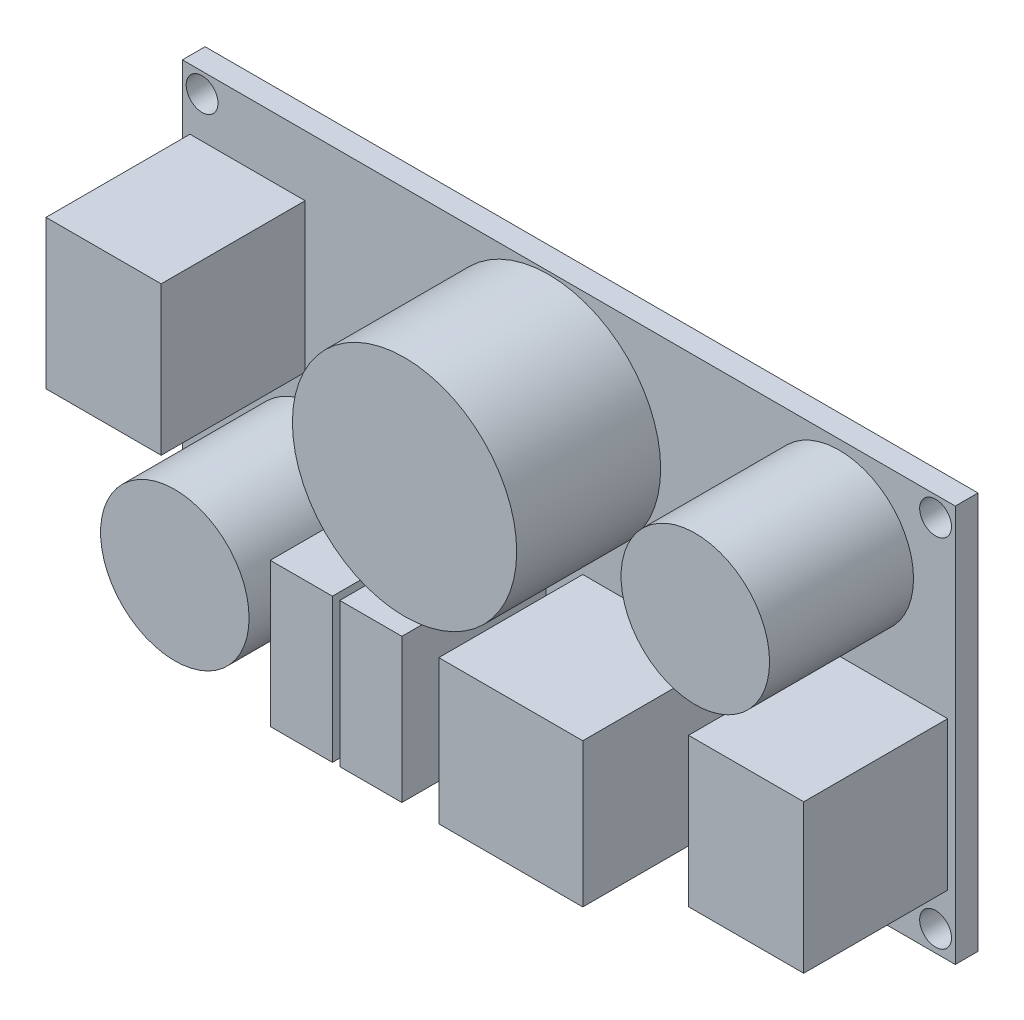
ISO-10303-21;
HEADER;
FILE_DESCRIPTION(('STEP AP214'),'2;1');
FILE_NAME('part.step','',(''),(''),'','','');
FILE_SCHEMA(('AUTOMOTIVE_DESIGN { 1 0 10303 214 1 1 1 1 }'));
ENDSEC;
DATA;
#1=APPLICATION_CONTEXT('core data for automotive mechanical design processes');
#2=APPLICATION_PROTOCOL_DEFINITION('international standard','automotive_design',2000,#1);
#3=PRODUCT_CONTEXT('',#1,'mechanical');
#4=PRODUCT('Part','Part','',(#3));
#5=PRODUCT_RELATED_PRODUCT_CATEGORY('part','',(#4));
#6=PRODUCT_DEFINITION_FORMATION('','',#4);
#7=PRODUCT_DEFINITION_CONTEXT('part definition',#1,'design');
#8=PRODUCT_DEFINITION('design','',#6,#7);
#9=PRODUCT_DEFINITION_SHAPE('','',#8);
#10=(LENGTH_UNIT() NAMED_UNIT(*) SI_UNIT(.MILLI.,.METRE.));
#11=(NAMED_UNIT(*) PLANE_ANGLE_UNIT() SI_UNIT($,.RADIAN.));
#12=(NAMED_UNIT(*) SI_UNIT($,.STERADIAN.) SOLID_ANGLE_UNIT());
#13=UNCERTAINTY_MEASURE_WITH_UNIT(LENGTH_MEASURE(1.E-05),#10,'distance_accuracy_value','');
#14=(GEOMETRIC_REPRESENTATION_CONTEXT(3) GLOBAL_UNCERTAINTY_ASSIGNED_CONTEXT((#13)) GLOBAL_UNIT_ASSIGNED_CONTEXT((#10,
#11,#12)) REPRESENTATION_CONTEXT('',''));
#15=CARTESIAN_POINT('',(0.,0.,0.));
#16=DIRECTION('',(0.,0.,1.));
#17=DIRECTION('',(1.,0.,0.));
#18=AXIS2_PLACEMENT_3D('',#15,#16,#17);
#19=CARTESIAN_POINT('',(0.,0.,1.5));
#20=DIRECTION('',(0.,0.,1.));
#21=DIRECTION('',(1.,0.,0.));
#22=AXIS2_PLACEMENT_3D('',#19,#20,#21);
#23=PLANE('',#22);
#24=CARTESIAN_POINT('',(-24.2002128836283,-11.7070965702177,1.5));
#25=DIRECTION('',(0.,0.,1.));
#26=DIRECTION('',(1.,0.,0.));
#27=AXIS2_PLACEMENT_3D('',#24,#25,#26);
#28=CIRCLE('',#27,1.05);
#29=CARTESIAN_POINT('',(-23.1502128836283,-11.7070965702177,1.5));
#30=VERTEX_POINT('',#29);
#31=EDGE_CURVE('E817',#30,#30,#28,.T.);
#32=ORIENTED_EDGE('',*,*,#31,.F.);
#33=EDGE_LOOP('',(#32));
#34=FACE_BOUND('',#33,.T.);
#35=CARTESIAN_POINT('',(24.1997871163717,-11.7070965702177,1.5));
#36=DIRECTION('',(0.,0.,1.));
#37=DIRECTION('',(1.,0.,0.));
#38=AXIS2_PLACEMENT_3D('',#35,#36,#37);
#39=CIRCLE('',#38,1.05);
#40=CARTESIAN_POINT('',(25.2497871163717,-11.7070965702177,1.5));
#41=VERTEX_POINT('',#40);
#42=EDGE_CURVE('E819',#41,#41,#39,.T.);
#43=ORIENTED_EDGE('',*,*,#42,.F.);
#44=EDGE_LOOP('',(#43));
#45=FACE_BOUND('',#44,.T.);
#46=CARTESIAN_POINT('',(24.1997871163715,11.7929034297823,1.5));
#47=DIRECTION('',(0.,0.,1.));
#48=DIRECTION('',(1.,0.,0.));
#49=AXIS2_PLACEMENT_3D('',#46,#47,#48);
#50=CIRCLE('',#49,1.05);
#51=CARTESIAN_POINT('',(25.2497871163715,11.7929034297823,1.5));
#52=VERTEX_POINT('',#51);
#53=EDGE_CURVE('E861',#52,#52,#50,.T.);
#54=ORIENTED_EDGE('',*,*,#53,.F.);
#55=EDGE_LOOP('',(#54));
#56=FACE_BOUND('',#55,.T.);
#57=CARTESIAN_POINT('',(-24.2002128836285,11.7929034297823,1.5));
#58=DIRECTION('',(0.,0.,1.));
#59=DIRECTION('',(1.,0.,0.));
#60=AXIS2_PLACEMENT_3D('',#57,#58,#59);
#61=CIRCLE('',#60,1.05);
#62=CARTESIAN_POINT('',(-23.1502128836285,11.7929034297823,1.5));
#63=VERTEX_POINT('',#62);
#64=EDGE_CURVE('E827',#63,#63,#61,.T.);
#65=ORIENTED_EDGE('',*,*,#64,.F.);
#66=EDGE_LOOP('',(#65));
#67=FACE_BOUND('',#66,.T.);
#68=CARTESIAN_POINT('',(-16.5,-7.09999999999999,1.5));
#69=DIRECTION('',(0.,0.,1.));
#70=DIRECTION('',(1.,0.,0.));
#71=AXIS2_PLACEMENT_3D('',#68,#69,#70);
#72=CIRCLE('',#71,4.9);
#73=CARTESIAN_POINT('',(-11.6,-7.09999999999999,1.5));
#74=VERTEX_POINT('',#73);
#75=EDGE_CURVE('E826',#74,#74,#72,.T.);
#76=ORIENTED_EDGE('',*,*,#75,.F.);
#77=EDGE_LOOP('',(#76));
#78=FACE_BOUND('',#77,.T.);
#79=CARTESIAN_POINT('',(-1.34038090498764,5.51921549112562,1.5));
#80=DIRECTION('',(0.,0.,1.));
#81=DIRECTION('',(1.,0.,0.));
#82=AXIS2_PLACEMENT_3D('',#79,#80,#81);
#83=CIRCLE('',#82,7.4);
#84=CARTESIAN_POINT('',(6.05961909501236,5.51921549112562,1.5));
#85=VERTEX_POINT('',#84);
#86=EDGE_CURVE('E223',#85,#85,#83,.T.);
#87=ORIENTED_EDGE('',*,*,#86,.F.);
#88=EDGE_LOOP('',(#87));
#89=FACE_BOUND('',#88,.T.);
#90=CARTESIAN_POINT('',(17.8454634213061,7.56920981640084,1.5));
#91=DIRECTION('',(0.,0.,1.));
#92=DIRECTION('',(1.,0.,0.));
#93=AXIS2_PLACEMENT_3D('',#90,#91,#92);
#94=CIRCLE('',#93,4.9);
#95=CARTESIAN_POINT('',(22.7454634213061,7.56920981640084,1.5));
#96=VERTEX_POINT('',#95);
#97=EDGE_CURVE('E232',#96,#96,#94,.T.);
#98=ORIENTED_EDGE('',*,*,#97,.F.);
#99=EDGE_LOOP('',(#98));
#100=FACE_BOUND('',#99,.T.);
#101=DIRECTION('',(0.,1.,0.));
#102=VECTOR('',#101,1.);
#103=CARTESIAN_POINT('',(25.5,13.1,1.5));
#104=LINE('',#103,#102);
#105=CARTESIAN_POINT('',(25.5,-13.1,1.5));
#106=VERTEX_POINT('',#105);
#107=CARTESIAN_POINT('',(25.5,13.1,1.5));
#108=VERTEX_POINT('',#107);
#109=EDGE_CURVE('E354',#106,#108,#104,.T.);
#110=ORIENTED_EDGE('',*,*,#109,.T.);
#111=DIRECTION('',(-1.,0.,0.));
#112=VECTOR('',#111,1.);
#113=CARTESIAN_POINT('',(-25.5,13.1,1.5));
#114=LINE('',#113,#112);
#115=CARTESIAN_POINT('',(-25.5,13.1,1.5));
#116=VERTEX_POINT('',#115);
#117=EDGE_CURVE('E357',#108,#116,#114,.T.);
#118=ORIENTED_EDGE('',*,*,#117,.T.);
#119=DIRECTION('',(0.,-1.,0.));
#120=VECTOR('',#119,1.);
#121=CARTESIAN_POINT('',(-25.5,13.1,1.5));
#122=LINE('',#121,#120);
#123=CARTESIAN_POINT('',(-25.5,-13.1,1.5));
#124=VERTEX_POINT('',#123);
#125=EDGE_CURVE('E360',#116,#124,#122,.T.);
#126=ORIENTED_EDGE('',*,*,#125,.T.);
#127=DIRECTION('',(1.,0.,0.));
#128=VECTOR('',#127,1.);
#129=CARTESIAN_POINT('',(-25.5,-13.1,1.5));
#130=LINE('',#129,#128);
#131=EDGE_CURVE('E362',#124,#106,#130,.T.);
#132=ORIENTED_EDGE('',*,*,#131,.T.);
#133=EDGE_LOOP('',(#110,#118,#126,#132));
#134=FACE_BOUND('',#133,.T.);
#135=DIRECTION('',(-1.,0.,0.));
#136=VECTOR('',#135,1.);
#137=CARTESIAN_POINT('',(-25.,9.10000000000001,1.5));
#138=LINE('',#137,#136);
#139=CARTESIAN_POINT('',(-17.4,9.10000000000001,1.5));
#140=VERTEX_POINT('',#139);
#141=CARTESIAN_POINT('',(-25.,9.10000000000001,1.5));
#142=VERTEX_POINT('',#141);
#143=EDGE_CURVE('E338',#140,#142,#138,.T.);
#144=ORIENTED_EDGE('',*,*,#143,.F.);
#145=DIRECTION('',(0.,1.,0.));
#146=VECTOR('',#145,1.);
#147=CARTESIAN_POINT('',(-17.4,9.10000000000001,1.5));
#148=LINE('',#147,#146);
#149=CARTESIAN_POINT('',(-17.4,-0.699999999999994,1.5));
#150=VERTEX_POINT('',#149);
#151=EDGE_CURVE('E324',#150,#140,#148,.T.);
#152=ORIENTED_EDGE('',*,*,#151,.F.);
#153=DIRECTION('',(1.,0.,0.));
#154=VECTOR('',#153,1.);
#155=CARTESIAN_POINT('',(-25.,-0.699999999999994,1.5));
#156=LINE('',#155,#154);
#157=CARTESIAN_POINT('',(-25.,-0.699999999999994,1.5));
#158=VERTEX_POINT('',#157);
#159=EDGE_CURVE('E329',#158,#150,#156,.T.);
#160=ORIENTED_EDGE('',*,*,#159,.F.);
#161=DIRECTION('',(0.,-1.,0.));
#162=VECTOR('',#161,1.);
#163=CARTESIAN_POINT('',(-25.,9.10000000000001,1.5));
#164=LINE('',#163,#162);
#165=EDGE_CURVE('E340',#142,#158,#164,.T.);
#166=ORIENTED_EDGE('',*,*,#165,.F.);
#167=EDGE_LOOP('',(#144,#152,#160,#166));
#168=FACE_BOUND('',#167,.T.);
#169=DIRECTION('',(-1.,0.,0.));
#170=VECTOR('',#169,1.);
#171=CARTESIAN_POINT('',(17.4,0.700000000000008,1.5));
#172=LINE('',#171,#170);
#173=CARTESIAN_POINT('',(25.,0.700000000000008,1.5));
#174=VERTEX_POINT('',#173);
#175=CARTESIAN_POINT('',(17.4,0.700000000000008,1.5));
#176=VERTEX_POINT('',#175);
#177=EDGE_CURVE('E309',#174,#176,#172,.T.);
#178=ORIENTED_EDGE('',*,*,#177,.F.);
#179=DIRECTION('',(0.,1.,0.));
#180=VECTOR('',#179,1.);
#181=CARTESIAN_POINT('',(25.,0.700000000000008,1.5));
#182=LINE('',#181,#180);
#183=CARTESIAN_POINT('',(25.,-9.09999999999999,1.5));
#184=VERTEX_POINT('',#183);
#185=EDGE_CURVE('E295',#184,#174,#182,.T.);
#186=ORIENTED_EDGE('',*,*,#185,.F.);
#187=DIRECTION('',(1.,0.,0.));
#188=VECTOR('',#187,1.);
#189=CARTESIAN_POINT('',(17.4,-9.09999999999999,1.5));
#190=LINE('',#189,#188);
#191=CARTESIAN_POINT('',(17.4,-9.09999999999999,1.5));
#192=VERTEX_POINT('',#191);
#193=EDGE_CURVE('E300',#192,#184,#190,.T.);
#194=ORIENTED_EDGE('',*,*,#193,.F.);
#195=DIRECTION('',(0.,-1.,0.));
#196=VECTOR('',#195,1.);
#197=CARTESIAN_POINT('',(17.4,0.700000000000008,1.5));
#198=LINE('',#197,#196);
#199=EDGE_CURVE('E311',#176,#192,#198,.T.);
#200=ORIENTED_EDGE('',*,*,#199,.F.);
#201=EDGE_LOOP('',(#178,#186,#194,#200));
#202=FACE_BOUND('',#201,.T.);
#203=DIRECTION('',(-1.,0.,0.));
#204=VECTOR('',#203,1.);
#205=CARTESIAN_POINT('',(-10.2,-3.09999999999999,1.5));
#206=LINE('',#205,#204);
#207=CARTESIAN_POINT('',(-6.09999999999998,-3.09999999999999,1.5));
#208=VERTEX_POINT('',#207);
#209=CARTESIAN_POINT('',(-10.2,-3.09999999999999,1.5));
#210=VERTEX_POINT('',#209);
#211=EDGE_CURVE('E280',#208,#210,#206,.T.);
#212=ORIENTED_EDGE('',*,*,#211,.F.);
#213=DIRECTION('',(0.,1.,0.));
#214=VECTOR('',#213,1.);
#215=CARTESIAN_POINT('',(-6.09999999999998,-3.09999999999999,1.5));
#216=LINE('',#215,#214);
#217=CARTESIAN_POINT('',(-6.09999999999998,-12.6,1.5));
#218=VERTEX_POINT('',#217);
#219=EDGE_CURVE('E266',#218,#208,#216,.T.);
#220=ORIENTED_EDGE('',*,*,#219,.F.);
#221=DIRECTION('',(1.,0.,0.));
#222=VECTOR('',#221,1.);
#223=CARTESIAN_POINT('',(-10.2,-12.6,1.5));
#224=LINE('',#223,#222);
#225=CARTESIAN_POINT('',(-10.2,-12.6,1.5));
#226=VERTEX_POINT('',#225);
#227=EDGE_CURVE('E271',#226,#218,#224,.T.);
#228=ORIENTED_EDGE('',*,*,#227,.F.);
#229=DIRECTION('',(0.,-1.,0.));
#230=VECTOR('',#229,1.);
#231=CARTESIAN_POINT('',(-10.2,-3.09999999999999,1.5));
#232=LINE('',#231,#230);
#233=EDGE_CURVE('E282',#210,#226,#232,.T.);
#234=ORIENTED_EDGE('',*,*,#233,.F.);
#235=EDGE_LOOP('',(#212,#220,#228,#234));
#236=FACE_BOUND('',#235,.T.);
#237=DIRECTION('',(-1.,0.,0.));
#238=VECTOR('',#237,1.);
#239=CARTESIAN_POINT('',(-5.61558274573255,-3.09999999999999,1.5));
#240=LINE('',#239,#238);
#241=CARTESIAN_POINT('',(-1.51558274573255,-3.09999999999999,1.5));
#242=VERTEX_POINT('',#241);
#243=CARTESIAN_POINT('',(-5.61558274573255,-3.09999999999999,1.5));
#244=VERTEX_POINT('',#243);
#245=EDGE_CURVE('E253',#242,#244,#240,.T.);
#246=ORIENTED_EDGE('',*,*,#245,.F.);
#247=DIRECTION('',(0.,1.,0.));
#248=VECTOR('',#247,1.);
#249=CARTESIAN_POINT('',(-1.51558274573255,-3.09999999999999,1.5));
#250=LINE('',#249,#248);
#251=CARTESIAN_POINT('',(-1.51558274573255,-12.6,1.5));
#252=VERTEX_POINT('',#251);
#253=EDGE_CURVE('E237',#252,#242,#250,.T.);
#254=ORIENTED_EDGE('',*,*,#253,.F.);
#255=DIRECTION('',(1.,0.,0.));
#256=VECTOR('',#255,1.);
#257=CARTESIAN_POINT('',(-5.61558274573255,-12.6,1.5));
#258=LINE('',#257,#256);
#259=CARTESIAN_POINT('',(-5.61558274573255,-12.6,1.5));
#260=VERTEX_POINT('',#259);
#261=EDGE_CURVE('E244',#260,#252,#258,.T.);
#262=ORIENTED_EDGE('',*,*,#261,.F.);
#263=DIRECTION('',(0.,-1.,0.));
#264=VECTOR('',#263,1.);
#265=CARTESIAN_POINT('',(-5.61558274573255,-3.09999999999999,1.5));
#266=LINE('',#265,#264);
#267=EDGE_CURVE('E255',#244,#260,#266,.T.);
#268=ORIENTED_EDGE('',*,*,#267,.F.);
#269=EDGE_LOOP('',(#246,#254,#262,#268));
#270=FACE_BOUND('',#269,.T.);
#271=DIRECTION('',(-1.,0.,0.));
#272=VECTOR('',#271,1.);
#273=CARTESIAN_POINT('',(0.919869248520959,-3.10127346644199,1.5));
#274=LINE('',#273,#272);
#275=CARTESIAN_POINT('',(10.419869248521,-3.10127346644199,1.5));
#276=VERTEX_POINT('',#275);
#277=CARTESIAN_POINT('',(0.919869248520959,-3.10127346644199,1.5));
#278=VERTEX_POINT('',#277);
#279=EDGE_CURVE('E840',#276,#278,#274,.T.);
#280=ORIENTED_EDGE('',*,*,#279,.F.);
#281=DIRECTION('',(0.,1.,0.));
#282=VECTOR('',#281,1.);
#283=CARTESIAN_POINT('',(10.419869248521,-3.10127346644199,1.5));
#284=LINE('',#283,#282);
#285=CARTESIAN_POINT('',(10.419869248521,-12.601273466442,1.5));
#286=VERTEX_POINT('',#285);
#287=EDGE_CURVE('E221',#286,#276,#284,.T.);
#288=ORIENTED_EDGE('',*,*,#287,.F.);
#289=DIRECTION('',(1.,0.,0.));
#290=VECTOR('',#289,1.);
#291=CARTESIAN_POINT('',(0.919869248520959,-12.601273466442,1.5));
#292=LINE('',#291,#290);
#293=CARTESIAN_POINT('',(0.919869248520959,-12.601273466442,1.5));
#294=VERTEX_POINT('',#293);
#295=EDGE_CURVE('E217',#294,#286,#292,.T.);
#296=ORIENTED_EDGE('',*,*,#295,.F.);
#297=DIRECTION('',(0.,-1.,0.));
#298=VECTOR('',#297,1.);
#299=CARTESIAN_POINT('',(0.919869248520959,-3.10127346644199,1.5));
#300=LINE('',#299,#298);
#301=EDGE_CURVE('E842',#278,#294,#300,.T.);
#302=ORIENTED_EDGE('',*,*,#301,.F.);
#303=EDGE_LOOP('',(#280,#288,#296,#302));
#304=FACE_BOUND('',#303,.T.);
#305=ADVANCED_FACE('F36',(#34,#45,#56,#67,#78,#89,#100,#134,#168,#202,#236,#270,#304),#23,.T.);
#306=CARTESIAN_POINT('',(25.5,13.1,1.5));
#307=DIRECTION('',(-1.,0.,0.));
#308=DIRECTION('',(0.,0.,1.));
#309=AXIS2_PLACEMENT_3D('',#306,#307,#308);
#310=PLANE('',#309);
#311=DIRECTION('',(0.,1.,0.));
#312=VECTOR('',#311,1.);
#313=CARTESIAN_POINT('',(25.5,13.1,0.));
#314=LINE('',#313,#312);
#315=CARTESIAN_POINT('',(25.5,-13.1,0.));
#316=VERTEX_POINT('',#315);
#317=CARTESIAN_POINT('',(25.5,13.1,0.));
#318=VERTEX_POINT('',#317);
#319=EDGE_CURVE('E353',#316,#318,#314,.T.);
#320=ORIENTED_EDGE('',*,*,#319,.T.);
#321=DIRECTION('',(0.,0.,-1.));
#322=VECTOR('',#321,1.);
#323=CARTESIAN_POINT('',(25.5,13.1,1.5));
#324=LINE('',#323,#322);
#325=EDGE_CURVE('E11',#108,#318,#324,.T.);
#326=ORIENTED_EDGE('',*,*,#325,.F.);
#327=ORIENTED_EDGE('',*,*,#109,.F.);
#328=DIRECTION('',(0.,0.,-1.));
#329=VECTOR('',#328,1.);
#330=CARTESIAN_POINT('',(25.5,-13.1,1.5));
#331=LINE('',#330,#329);
#332=EDGE_CURVE('E364',#106,#316,#331,.T.);
#333=ORIENTED_EDGE('',*,*,#332,.T.);
#334=EDGE_LOOP('',(#320,#326,#327,#333));
#335=FACE_BOUND('',#334,.T.);
#336=ADVANCED_FACE('F38',(#335),#310,.F.);
#337=CARTESIAN_POINT('',(-25.5,13.1,1.5));
#338=DIRECTION('',(0.,-1.,0.));
#339=DIRECTION('',(0.,0.,-1.));
#340=AXIS2_PLACEMENT_3D('',#337,#338,#339);
#341=PLANE('',#340);
#342=DIRECTION('',(-1.,0.,0.));
#343=VECTOR('',#342,1.);
#344=CARTESIAN_POINT('',(-25.5,13.1,0.));
#345=LINE('',#344,#343);
#346=CARTESIAN_POINT('',(-25.5,13.1,0.));
#347=VERTEX_POINT('',#346);
#348=EDGE_CURVE('E367',#318,#347,#345,.T.);
#349=ORIENTED_EDGE('',*,*,#348,.T.);
#350=DIRECTION('',(0.,0.,-1.));
#351=VECTOR('',#350,1.);
#352=CARTESIAN_POINT('',(-25.5,13.1,1.5));
#353=LINE('',#352,#351);
#354=EDGE_CURVE('E44',#116,#347,#353,.T.);
#355=ORIENTED_EDGE('',*,*,#354,.F.);
#356=ORIENTED_EDGE('',*,*,#117,.F.);
#357=ORIENTED_EDGE('',*,*,#325,.T.);
#358=EDGE_LOOP('',(#349,#355,#356,#357));
#359=FACE_BOUND('',#358,.T.);
#360=ADVANCED_FACE('F397',(#359),#341,.F.);
#361=CARTESIAN_POINT('',(-25.5,13.1,1.5));
#362=DIRECTION('',(1.,0.,0.));
#363=DIRECTION('',(0.,1.,0.));
#364=AXIS2_PLACEMENT_3D('',#361,#362,#363);
#365=PLANE('',#364);
#366=DIRECTION('',(0.,-1.,0.));
#367=VECTOR('',#366,1.);
#368=CARTESIAN_POINT('',(-25.5,13.1,0.));
#369=LINE('',#368,#367);
#370=CARTESIAN_POINT('',(-25.5,-13.1,0.));
#371=VERTEX_POINT('',#370);
#372=EDGE_CURVE('E369',#347,#371,#369,.T.);
#373=ORIENTED_EDGE('',*,*,#372,.T.);
#374=DIRECTION('',(0.,0.,-1.));
#375=VECTOR('',#374,1.);
#376=CARTESIAN_POINT('',(-25.5,-13.1,1.5));
#377=LINE('',#376,#375);
#378=EDGE_CURVE('E374',#124,#371,#377,.T.);
#379=ORIENTED_EDGE('',*,*,#378,.F.);
#380=ORIENTED_EDGE('',*,*,#125,.F.);
#381=ORIENTED_EDGE('',*,*,#354,.T.);
#382=EDGE_LOOP('',(#373,#379,#380,#381));
#383=FACE_BOUND('',#382,.T.);
#384=ADVANCED_FACE('F381',(#383),#365,.F.);
#385=CARTESIAN_POINT('',(-25.5,-13.1,1.5));
#386=DIRECTION('',(0.,1.,0.));
#387=DIRECTION('',(0.,0.,1.));
#388=AXIS2_PLACEMENT_3D('',#385,#386,#387);
#389=PLANE('',#388);
#390=DIRECTION('',(1.,0.,0.));
#391=VECTOR('',#390,1.);
#392=CARTESIAN_POINT('',(-25.5,-13.1,0.));
#393=LINE('',#392,#391);
#394=EDGE_CURVE('E358',#371,#316,#393,.T.);
#395=ORIENTED_EDGE('',*,*,#394,.T.);
#396=ORIENTED_EDGE('',*,*,#332,.F.);
#397=ORIENTED_EDGE('',*,*,#131,.F.);
#398=ORIENTED_EDGE('',*,*,#378,.T.);
#399=EDGE_LOOP('',(#395,#396,#397,#398));
#400=FACE_BOUND('',#399,.T.);
#401=ADVANCED_FACE('F390',(#400),#389,.F.);
#402=CARTESIAN_POINT('',(0.,0.,0.));
#403=DIRECTION('',(0.,0.,1.));
#404=DIRECTION('',(1.,0.,0.));
#405=AXIS2_PLACEMENT_3D('',#402,#403,#404);
#406=PLANE('',#405);
#407=CARTESIAN_POINT('',(-24.2002128836283,-11.7070965702177,0.));
#408=DIRECTION('',(0.,0.,1.));
#409=DIRECTION('',(1.,0.,0.));
#410=AXIS2_PLACEMENT_3D('',#407,#408,#409);
#411=CIRCLE('',#410,1.05);
#412=CARTESIAN_POINT('',(-23.1502128836283,-11.7070965702177,0.));
#413=VERTEX_POINT('',#412);
#414=EDGE_CURVE('E815',#413,#413,#411,.T.);
#415=ORIENTED_EDGE('',*,*,#414,.T.);
#416=EDGE_LOOP('',(#415));
#417=FACE_BOUND('',#416,.T.);
#418=CARTESIAN_POINT('',(24.1997871163717,-11.7070965702177,0.));
#419=DIRECTION('',(0.,0.,1.));
#420=DIRECTION('',(1.,0.,0.));
#421=AXIS2_PLACEMENT_3D('',#418,#419,#420);
#422=CIRCLE('',#421,1.05);
#423=CARTESIAN_POINT('',(25.2497871163717,-11.7070965702177,0.));
#424=VERTEX_POINT('',#423);
#425=EDGE_CURVE('E866',#424,#424,#422,.T.);
#426=ORIENTED_EDGE('',*,*,#425,.T.);
#427=EDGE_LOOP('',(#426));
#428=FACE_BOUND('',#427,.T.);
#429=CARTESIAN_POINT('',(24.1997871163715,11.7929034297823,0.));
#430=DIRECTION('',(0.,0.,1.));
#431=DIRECTION('',(1.,0.,0.));
#432=AXIS2_PLACEMENT_3D('',#429,#430,#431);
#433=CIRCLE('',#432,1.05);
#434=CARTESIAN_POINT('',(25.2497871163715,11.7929034297823,0.));
#435=VERTEX_POINT('',#434);
#436=EDGE_CURVE('E830',#435,#435,#433,.T.);
#437=ORIENTED_EDGE('',*,*,#436,.T.);
#438=EDGE_LOOP('',(#437));
#439=FACE_BOUND('',#438,.T.);
#440=CARTESIAN_POINT('',(-24.2002128836285,11.7929034297823,0.));
#441=DIRECTION('',(0.,0.,1.));
#442=DIRECTION('',(1.,0.,0.));
#443=AXIS2_PLACEMENT_3D('',#440,#441,#442);
#444=CIRCLE('',#443,1.05);
#445=CARTESIAN_POINT('',(-23.1502128836285,11.7929034297823,0.));
#446=VERTEX_POINT('',#445);
#447=EDGE_CURVE('E823',#446,#446,#444,.T.);
#448=ORIENTED_EDGE('',*,*,#447,.T.);
#449=EDGE_LOOP('',(#448));
#450=FACE_BOUND('',#449,.T.);
#451=ORIENTED_EDGE('',*,*,#319,.F.);
#452=ORIENTED_EDGE('',*,*,#394,.F.);
#453=ORIENTED_EDGE('',*,*,#372,.F.);
#454=ORIENTED_EDGE('',*,*,#348,.F.);
#455=EDGE_LOOP('',(#451,#452,#453,#454));
#456=FACE_BOUND('',#455,.T.);
#457=ADVANCED_FACE('F387',(#417,#428,#439,#450,#456),#406,.F.);
#458=CARTESIAN_POINT('',(-17.4,9.10000000000001,11.));
#459=DIRECTION('',(-1.,0.,0.));
#460=DIRECTION('',(0.,0.,1.));
#461=AXIS2_PLACEMENT_3D('',#458,#459,#460);
#462=PLANE('',#461);
#463=ORIENTED_EDGE('',*,*,#151,.T.);
#464=DIRECTION('',(0.,0.,-1.));
#465=VECTOR('',#464,1.);
#466=CARTESIAN_POINT('',(-17.4,9.10000000000001,11.));
#467=LINE('',#466,#465);
#468=CARTESIAN_POINT('',(-17.4,9.10000000000001,11.));
#469=VERTEX_POINT('',#468);
#470=EDGE_CURVE('E351',#469,#140,#467,.T.);
#471=ORIENTED_EDGE('',*,*,#470,.F.);
#472=DIRECTION('',(0.,1.,0.));
#473=VECTOR('',#472,1.);
#474=CARTESIAN_POINT('',(-17.4,9.10000000000001,11.));
#475=LINE('',#474,#473);
#476=CARTESIAN_POINT('',(-17.4,-0.699999999999994,11.));
#477=VERTEX_POINT('',#476);
#478=EDGE_CURVE('E325',#477,#469,#475,.T.);
#479=ORIENTED_EDGE('',*,*,#478,.F.);
#480=DIRECTION('',(0.,0.,-1.));
#481=VECTOR('',#480,1.);
#482=CARTESIAN_POINT('',(-17.4,-0.699999999999994,11.));
#483=LINE('',#482,#481);
#484=EDGE_CURVE('E335',#477,#150,#483,.T.);
#485=ORIENTED_EDGE('',*,*,#484,.T.);
#486=EDGE_LOOP('',(#463,#471,#479,#485));
#487=FACE_BOUND('',#486,.T.);
#488=ADVANCED_FACE('F413',(#487),#462,.F.);
#489=CARTESIAN_POINT('',(-25.,9.10000000000001,11.));
#490=DIRECTION('',(0.,-1.,0.));
#491=DIRECTION('',(0.,0.,-1.));
#492=AXIS2_PLACEMENT_3D('',#489,#490,#491);
#493=PLANE('',#492);
#494=ORIENTED_EDGE('',*,*,#143,.T.);
#495=DIRECTION('',(0.,0.,-1.));
#496=VECTOR('',#495,1.);
#497=CARTESIAN_POINT('',(-25.,9.10000000000001,11.));
#498=LINE('',#497,#496);
#499=CARTESIAN_POINT('',(-25.,9.10000000000001,11.));
#500=VERTEX_POINT('',#499);
#501=EDGE_CURVE('E348',#500,#142,#498,.T.);
#502=ORIENTED_EDGE('',*,*,#501,.F.);
#503=DIRECTION('',(-1.,0.,0.));
#504=VECTOR('',#503,1.);
#505=CARTESIAN_POINT('',(-25.,9.10000000000001,11.));
#506=LINE('',#505,#504);
#507=EDGE_CURVE('E328',#469,#500,#506,.T.);
#508=ORIENTED_EDGE('',*,*,#507,.F.);
#509=ORIENTED_EDGE('',*,*,#470,.T.);
#510=EDGE_LOOP('',(#494,#502,#508,#509));
#511=FACE_BOUND('',#510,.T.);
#512=ADVANCED_FACE('F434',(#511),#493,.F.);
#513=CARTESIAN_POINT('',(-25.,9.10000000000001,11.));
#514=DIRECTION('',(1.,0.,0.));
#515=DIRECTION('',(0.,1.,0.));
#516=AXIS2_PLACEMENT_3D('',#513,#514,#515);
#517=PLANE('',#516);
#518=ORIENTED_EDGE('',*,*,#165,.T.);
#519=DIRECTION('',(0.,0.,-1.));
#520=VECTOR('',#519,1.);
#521=CARTESIAN_POINT('',(-25.,-0.699999999999994,11.));
#522=LINE('',#521,#520);
#523=CARTESIAN_POINT('',(-25.,-0.699999999999994,11.));
#524=VERTEX_POINT('',#523);
#525=EDGE_CURVE('E346',#524,#158,#522,.T.);
#526=ORIENTED_EDGE('',*,*,#525,.F.);
#527=DIRECTION('',(0.,-1.,0.));
#528=VECTOR('',#527,1.);
#529=CARTESIAN_POINT('',(-25.,9.10000000000001,11.));
#530=LINE('',#529,#528);
#531=EDGE_CURVE('E331',#500,#524,#530,.T.);
#532=ORIENTED_EDGE('',*,*,#531,.F.);
#533=ORIENTED_EDGE('',*,*,#501,.T.);
#534=EDGE_LOOP('',(#518,#526,#532,#533));
#535=FACE_BOUND('',#534,.T.);
#536=ADVANCED_FACE('F441',(#535),#517,.F.);
#537=CARTESIAN_POINT('',(-25.,-0.699999999999994,11.));
#538=DIRECTION('',(0.,1.,0.));
#539=DIRECTION('',(0.,0.,1.));
#540=AXIS2_PLACEMENT_3D('',#537,#538,#539);
#541=PLANE('',#540);
#542=ORIENTED_EDGE('',*,*,#159,.T.);
#543=ORIENTED_EDGE('',*,*,#484,.F.);
#544=DIRECTION('',(1.,0.,0.));
#545=VECTOR('',#544,1.);
#546=CARTESIAN_POINT('',(-25.,-0.699999999999994,11.));
#547=LINE('',#546,#545);
#548=EDGE_CURVE('E333',#524,#477,#547,.T.);
#549=ORIENTED_EDGE('',*,*,#548,.F.);
#550=ORIENTED_EDGE('',*,*,#525,.T.);
#551=EDGE_LOOP('',(#542,#543,#549,#550));
#552=FACE_BOUND('',#551,.T.);
#553=ADVANCED_FACE('F448',(#552),#541,.F.);
#554=CARTESIAN_POINT('',(0.,0.,11.));
#555=DIRECTION('',(0.,0.,1.));
#556=DIRECTION('',(1.,0.,0.));
#557=AXIS2_PLACEMENT_3D('',#554,#555,#556);
#558=PLANE('',#557);
#559=ORIENTED_EDGE('',*,*,#478,.T.);
#560=ORIENTED_EDGE('',*,*,#507,.T.);
#561=ORIENTED_EDGE('',*,*,#531,.T.);
#562=ORIENTED_EDGE('',*,*,#548,.T.);
#563=EDGE_LOOP('',(#559,#560,#561,#562));
#564=FACE_BOUND('',#563,.T.);
#565=ADVANCED_FACE('F456',(#564),#558,.T.);
#566=CARTESIAN_POINT('',(25.,0.700000000000008,11.));
#567=DIRECTION('',(-1.,0.,0.));
#568=DIRECTION('',(0.,0.,1.));
#569=AXIS2_PLACEMENT_3D('',#566,#567,#568);
#570=PLANE('',#569);
#571=ORIENTED_EDGE('',*,*,#185,.T.);
#572=DIRECTION('',(0.,0.,-1.));
#573=VECTOR('',#572,1.);
#574=CARTESIAN_POINT('',(25.,0.700000000000008,11.));
#575=LINE('',#574,#573);
#576=CARTESIAN_POINT('',(25.,0.700000000000008,11.));
#577=VERTEX_POINT('',#576);
#578=EDGE_CURVE('E322',#577,#174,#575,.T.);
#579=ORIENTED_EDGE('',*,*,#578,.F.);
#580=DIRECTION('',(0.,1.,0.));
#581=VECTOR('',#580,1.);
#582=CARTESIAN_POINT('',(25.,0.700000000000008,11.));
#583=LINE('',#582,#581);
#584=CARTESIAN_POINT('',(25.,-9.09999999999999,11.));
#585=VERTEX_POINT('',#584);
#586=EDGE_CURVE('E296',#585,#577,#583,.T.);
#587=ORIENTED_EDGE('',*,*,#586,.F.);
#588=DIRECTION('',(0.,0.,-1.));
#589=VECTOR('',#588,1.);
#590=CARTESIAN_POINT('',(25.,-9.09999999999999,11.));
#591=LINE('',#590,#589);
#592=EDGE_CURVE('E306',#585,#184,#591,.T.);
#593=ORIENTED_EDGE('',*,*,#592,.T.);
#594=EDGE_LOOP('',(#571,#579,#587,#593));
#595=FACE_BOUND('',#594,.T.);
#596=ADVANCED_FACE('F464',(#595),#570,.F.);
#597=CARTESIAN_POINT('',(17.4,0.700000000000008,11.));
#598=DIRECTION('',(0.,-1.,0.));
#599=DIRECTION('',(1.,0.,0.));
#600=AXIS2_PLACEMENT_3D('',#597,#598,#599);
#601=PLANE('',#600);
#602=ORIENTED_EDGE('',*,*,#177,.T.);
#603=DIRECTION('',(0.,0.,-1.));
#604=VECTOR('',#603,1.);
#605=CARTESIAN_POINT('',(17.4,0.700000000000008,11.));
#606=LINE('',#605,#604);
#607=CARTESIAN_POINT('',(17.4,0.700000000000008,11.));
#608=VERTEX_POINT('',#607);
#609=EDGE_CURVE('E319',#608,#176,#606,.T.);
#610=ORIENTED_EDGE('',*,*,#609,.F.);
#611=DIRECTION('',(-1.,0.,0.));
#612=VECTOR('',#611,1.);
#613=CARTESIAN_POINT('',(17.4,0.700000000000008,11.));
#614=LINE('',#613,#612);
#615=EDGE_CURVE('E299',#577,#608,#614,.T.);
#616=ORIENTED_EDGE('',*,*,#615,.F.);
#617=ORIENTED_EDGE('',*,*,#578,.T.);
#618=EDGE_LOOP('',(#602,#610,#616,#617));
#619=FACE_BOUND('',#618,.T.);
#620=ADVANCED_FACE('F472',(#619),#601,.F.);
#621=CARTESIAN_POINT('',(17.4,0.700000000000008,11.));
#622=DIRECTION('',(1.,0.,0.));
#623=DIRECTION('',(0.,0.,-1.));
#624=AXIS2_PLACEMENT_3D('',#621,#622,#623);
#625=PLANE('',#624);
#626=ORIENTED_EDGE('',*,*,#199,.T.);
#627=DIRECTION('',(0.,0.,-1.));
#628=VECTOR('',#627,1.);
#629=CARTESIAN_POINT('',(17.4,-9.09999999999999,11.));
#630=LINE('',#629,#628);
#631=CARTESIAN_POINT('',(17.4,-9.09999999999999,11.));
#632=VERTEX_POINT('',#631);
#633=EDGE_CURVE('E317',#632,#192,#630,.T.);
#634=ORIENTED_EDGE('',*,*,#633,.F.);
#635=DIRECTION('',(0.,-1.,0.));
#636=VECTOR('',#635,1.);
#637=CARTESIAN_POINT('',(17.4,0.700000000000008,11.));
#638=LINE('',#637,#636);
#639=EDGE_CURVE('E302',#608,#632,#638,.T.);
#640=ORIENTED_EDGE('',*,*,#639,.F.);
#641=ORIENTED_EDGE('',*,*,#609,.T.);
#642=EDGE_LOOP('',(#626,#634,#640,#641));
#643=FACE_BOUND('',#642,.T.);
#644=ADVANCED_FACE('F480',(#643),#625,.F.);
#645=CARTESIAN_POINT('',(17.4,-9.09999999999999,11.));
#646=DIRECTION('',(0.,1.,0.));
#647=DIRECTION('',(0.,0.,1.));
#648=AXIS2_PLACEMENT_3D('',#645,#646,#647);
#649=PLANE('',#648);
#650=ORIENTED_EDGE('',*,*,#193,.T.);
#651=ORIENTED_EDGE('',*,*,#592,.F.);
#652=DIRECTION('',(1.,0.,0.));
#653=VECTOR('',#652,1.);
#654=CARTESIAN_POINT('',(17.4,-9.09999999999999,11.));
#655=LINE('',#654,#653);
#656=EDGE_CURVE('E304',#632,#585,#655,.T.);
#657=ORIENTED_EDGE('',*,*,#656,.F.);
#658=ORIENTED_EDGE('',*,*,#633,.T.);
#659=EDGE_LOOP('',(#650,#651,#657,#658));
#660=FACE_BOUND('',#659,.T.);
#661=ADVANCED_FACE('F488',(#660),#649,.F.);
#662=CARTESIAN_POINT('',(0.,0.,11.));
#663=DIRECTION('',(0.,0.,1.));
#664=DIRECTION('',(1.,0.,0.));
#665=AXIS2_PLACEMENT_3D('',#662,#663,#664);
#666=PLANE('',#665);
#667=ORIENTED_EDGE('',*,*,#586,.T.);
#668=ORIENTED_EDGE('',*,*,#615,.T.);
#669=ORIENTED_EDGE('',*,*,#639,.T.);
#670=ORIENTED_EDGE('',*,*,#656,.T.);
#671=EDGE_LOOP('',(#667,#668,#669,#670));
#672=FACE_BOUND('',#671,.T.);
#673=ADVANCED_FACE('F496',(#672),#666,.T.);
#674=CARTESIAN_POINT('',(-6.09999999999998,-3.09999999999999,11.));
#675=DIRECTION('',(-1.,0.,0.));
#676=DIRECTION('',(0.,0.,1.));
#677=AXIS2_PLACEMENT_3D('',#674,#675,#676);
#678=PLANE('',#677);
#679=ORIENTED_EDGE('',*,*,#219,.T.);
#680=DIRECTION('',(0.,0.,-1.));
#681=VECTOR('',#680,1.);
#682=CARTESIAN_POINT('',(-6.09999999999998,-3.09999999999999,11.));
#683=LINE('',#682,#681);
#684=CARTESIAN_POINT('',(-6.09999999999998,-3.09999999999999,11.));
#685=VERTEX_POINT('',#684);
#686=EDGE_CURVE('E293',#685,#208,#683,.T.);
#687=ORIENTED_EDGE('',*,*,#686,.F.);
#688=DIRECTION('',(0.,1.,0.));
#689=VECTOR('',#688,1.);
#690=CARTESIAN_POINT('',(-6.09999999999998,-3.09999999999999,11.));
#691=LINE('',#690,#689);
#692=CARTESIAN_POINT('',(-6.09999999999998,-12.6,11.));
#693=VERTEX_POINT('',#692);
#694=EDGE_CURVE('E267',#693,#685,#691,.T.);
#695=ORIENTED_EDGE('',*,*,#694,.F.);
#696=DIRECTION('',(0.,0.,-1.));
#697=VECTOR('',#696,1.);
#698=CARTESIAN_POINT('',(-6.09999999999998,-12.6,11.));
#699=LINE('',#698,#697);
#700=EDGE_CURVE('E277',#693,#218,#699,.T.);
#701=ORIENTED_EDGE('',*,*,#700,.T.);
#702=EDGE_LOOP('',(#679,#687,#695,#701));
#703=FACE_BOUND('',#702,.T.);
#704=ADVANCED_FACE('F504',(#703),#678,.F.);
#705=CARTESIAN_POINT('',(-10.2,-3.09999999999999,11.));
#706=DIRECTION('',(0.,-1.,0.));
#707=DIRECTION('',(0.,0.,-1.));
#708=AXIS2_PLACEMENT_3D('',#705,#706,#707);
#709=PLANE('',#708);
#710=ORIENTED_EDGE('',*,*,#211,.T.);
#711=DIRECTION('',(0.,0.,-1.));
#712=VECTOR('',#711,1.);
#713=CARTESIAN_POINT('',(-10.2,-3.09999999999999,11.));
#714=LINE('',#713,#712);
#715=CARTESIAN_POINT('',(-10.2,-3.09999999999999,11.));
#716=VERTEX_POINT('',#715);
#717=EDGE_CURVE('E290',#716,#210,#714,.T.);
#718=ORIENTED_EDGE('',*,*,#717,.F.);
#719=DIRECTION('',(-1.,0.,0.));
#720=VECTOR('',#719,1.);
#721=CARTESIAN_POINT('',(-10.2,-3.09999999999999,11.));
#722=LINE('',#721,#720);
#723=EDGE_CURVE('E270',#685,#716,#722,.T.);
#724=ORIENTED_EDGE('',*,*,#723,.F.);
#725=ORIENTED_EDGE('',*,*,#686,.T.);
#726=EDGE_LOOP('',(#710,#718,#724,#725));
#727=FACE_BOUND('',#726,.T.);
#728=ADVANCED_FACE('F512',(#727),#709,.F.);
#729=CARTESIAN_POINT('',(-10.2,-3.09999999999999,11.));
#730=DIRECTION('',(1.,0.,0.));
#731=DIRECTION('',(0.,1.,0.));
#732=AXIS2_PLACEMENT_3D('',#729,#730,#731);
#733=PLANE('',#732);
#734=ORIENTED_EDGE('',*,*,#233,.T.);
#735=DIRECTION('',(0.,0.,-1.));
#736=VECTOR('',#735,1.);
#737=CARTESIAN_POINT('',(-10.2,-12.6,11.));
#738=LINE('',#737,#736);
#739=CARTESIAN_POINT('',(-10.2,-12.6,11.));
#740=VERTEX_POINT('',#739);
#741=EDGE_CURVE('E288',#740,#226,#738,.T.);
#742=ORIENTED_EDGE('',*,*,#741,.F.);
#743=DIRECTION('',(0.,-1.,0.));
#744=VECTOR('',#743,1.);
#745=CARTESIAN_POINT('',(-10.2,-3.09999999999999,11.));
#746=LINE('',#745,#744);
#747=EDGE_CURVE('E273',#716,#740,#746,.T.);
#748=ORIENTED_EDGE('',*,*,#747,.F.);
#749=ORIENTED_EDGE('',*,*,#717,.T.);
#750=EDGE_LOOP('',(#734,#742,#748,#749));
#751=FACE_BOUND('',#750,.T.);
#752=ADVANCED_FACE('F520',(#751),#733,.F.);
#753=CARTESIAN_POINT('',(-10.2,-12.6,11.));
#754=DIRECTION('',(0.,1.,0.));
#755=DIRECTION('',(0.,0.,1.));
#756=AXIS2_PLACEMENT_3D('',#753,#754,#755);
#757=PLANE('',#756);
#758=ORIENTED_EDGE('',*,*,#227,.T.);
#759=ORIENTED_EDGE('',*,*,#700,.F.);
#760=DIRECTION('',(1.,0.,0.));
#761=VECTOR('',#760,1.);
#762=CARTESIAN_POINT('',(-10.2,-12.6,11.));
#763=LINE('',#762,#761);
#764=EDGE_CURVE('E275',#740,#693,#763,.T.);
#765=ORIENTED_EDGE('',*,*,#764,.F.);
#766=ORIENTED_EDGE('',*,*,#741,.T.);
#767=EDGE_LOOP('',(#758,#759,#765,#766));
#768=FACE_BOUND('',#767,.T.);
#769=ADVANCED_FACE('F528',(#768),#757,.F.);
#770=CARTESIAN_POINT('',(0.,0.,11.));
#771=DIRECTION('',(0.,0.,1.));
#772=DIRECTION('',(1.,0.,0.));
#773=AXIS2_PLACEMENT_3D('',#770,#771,#772);
#774=PLANE('',#773);
#775=ORIENTED_EDGE('',*,*,#694,.T.);
#776=ORIENTED_EDGE('',*,*,#723,.T.);
#777=ORIENTED_EDGE('',*,*,#747,.T.);
#778=ORIENTED_EDGE('',*,*,#764,.T.);
#779=EDGE_LOOP('',(#775,#776,#777,#778));
#780=FACE_BOUND('',#779,.T.);
#781=ADVANCED_FACE('F536',(#780),#774,.T.);
#782=CARTESIAN_POINT('',(-1.51558274573255,-3.09999999999999,11.));
#783=DIRECTION('',(-1.,0.,0.));
#784=DIRECTION('',(0.,-1.,0.));
#785=AXIS2_PLACEMENT_3D('',#782,#783,#784);
#786=PLANE('',#785);
#787=ORIENTED_EDGE('',*,*,#253,.T.);
#788=DIRECTION('',(0.,0.,-1.));
#789=VECTOR('',#788,1.);
#790=CARTESIAN_POINT('',(-1.51558274573255,-3.09999999999999,11.));
#791=LINE('',#790,#789);
#792=CARTESIAN_POINT('',(-1.51558274573255,-3.09999999999999,11.));
#793=VERTEX_POINT('',#792);
#794=EDGE_CURVE('E264',#793,#242,#791,.T.);
#795=ORIENTED_EDGE('',*,*,#794,.F.);
#796=DIRECTION('',(0.,1.,0.));
#797=VECTOR('',#796,1.);
#798=CARTESIAN_POINT('',(-1.51558274573255,-3.09999999999999,11.));
#799=LINE('',#798,#797);
#800=CARTESIAN_POINT('',(-1.51558274573255,-12.6,11.));
#801=VERTEX_POINT('',#800);
#802=EDGE_CURVE('E240',#801,#793,#799,.T.);
#803=ORIENTED_EDGE('',*,*,#802,.F.);
#804=DIRECTION('',(0.,0.,-1.));
#805=VECTOR('',#804,1.);
#806=CARTESIAN_POINT('',(-1.51558274573255,-12.6,11.));
#807=LINE('',#806,#805);
#808=EDGE_CURVE('E250',#801,#252,#807,.T.);
#809=ORIENTED_EDGE('',*,*,#808,.T.);
#810=EDGE_LOOP('',(#787,#795,#803,#809));
#811=FACE_BOUND('',#810,.T.);
#812=ADVANCED_FACE('F544',(#811),#786,.F.);
#813=CARTESIAN_POINT('',(-5.61558274573255,-3.09999999999999,11.));
#814=DIRECTION('',(0.,-1.,0.));
#815=DIRECTION('',(1.,0.,0.));
#816=AXIS2_PLACEMENT_3D('',#813,#814,#815);
#817=PLANE('',#816);
#818=ORIENTED_EDGE('',*,*,#245,.T.);
#819=DIRECTION('',(0.,0.,-1.));
#820=VECTOR('',#819,1.);
#821=CARTESIAN_POINT('',(-5.61558274573255,-3.09999999999999,11.));
#822=LINE('',#821,#820);
#823=CARTESIAN_POINT('',(-5.61558274573255,-3.09999999999999,11.));
#824=VERTEX_POINT('',#823);
#825=EDGE_CURVE('E261',#824,#244,#822,.T.);
#826=ORIENTED_EDGE('',*,*,#825,.F.);
#827=DIRECTION('',(-1.,0.,0.));
#828=VECTOR('',#827,1.);
#829=CARTESIAN_POINT('',(-5.61558274573255,-3.09999999999999,11.));
#830=LINE('',#829,#828);
#831=EDGE_CURVE('E243',#793,#824,#830,.T.);
#832=ORIENTED_EDGE('',*,*,#831,.F.);
#833=ORIENTED_EDGE('',*,*,#794,.T.);
#834=EDGE_LOOP('',(#818,#826,#832,#833));
#835=FACE_BOUND('',#834,.T.);
#836=ADVANCED_FACE('F552',(#835),#817,.F.);
#837=CARTESIAN_POINT('',(-5.61558274573255,-3.09999999999999,11.));
#838=DIRECTION('',(1.,0.,0.));
#839=DIRECTION('',(0.,0.,-1.));
#840=AXIS2_PLACEMENT_3D('',#837,#838,#839);
#841=PLANE('',#840);
#842=ORIENTED_EDGE('',*,*,#267,.T.);
#843=DIRECTION('',(0.,0.,-1.));
#844=VECTOR('',#843,1.);
#845=CARTESIAN_POINT('',(-5.61558274573255,-12.6,11.));
#846=LINE('',#845,#844);
#847=CARTESIAN_POINT('',(-5.61558274573255,-12.6,11.));
#848=VERTEX_POINT('',#847);
#849=EDGE_CURVE('E59',#848,#260,#846,.T.);
#850=ORIENTED_EDGE('',*,*,#849,.F.);
#851=DIRECTION('',(0.,-1.,0.));
#852=VECTOR('',#851,1.);
#853=CARTESIAN_POINT('',(-5.61558274573255,-3.09999999999999,11.));
#854=LINE('',#853,#852);
#855=EDGE_CURVE('E246',#824,#848,#854,.T.);
#856=ORIENTED_EDGE('',*,*,#855,.F.);
#857=ORIENTED_EDGE('',*,*,#825,.T.);
#858=EDGE_LOOP('',(#842,#850,#856,#857));
#859=FACE_BOUND('',#858,.T.);
#860=ADVANCED_FACE('F560',(#859),#841,.F.);
#861=CARTESIAN_POINT('',(-5.61558274573255,-12.6,11.));
#862=DIRECTION('',(0.,1.,0.));
#863=DIRECTION('',(0.,0.,1.));
#864=AXIS2_PLACEMENT_3D('',#861,#862,#863);
#865=PLANE('',#864);
#866=ORIENTED_EDGE('',*,*,#261,.T.);
#867=ORIENTED_EDGE('',*,*,#808,.F.);
#868=DIRECTION('',(1.,0.,0.));
#869=VECTOR('',#868,1.);
#870=CARTESIAN_POINT('',(-5.61558274573255,-12.6,11.));
#871=LINE('',#870,#869);
#872=EDGE_CURVE('E248',#848,#801,#871,.T.);
#873=ORIENTED_EDGE('',*,*,#872,.F.);
#874=ORIENTED_EDGE('',*,*,#849,.T.);
#875=EDGE_LOOP('',(#866,#867,#873,#874));
#876=FACE_BOUND('',#875,.T.);
#877=ADVANCED_FACE('F568',(#876),#865,.F.);
#878=CARTESIAN_POINT('',(0.,0.,11.));
#879=DIRECTION('',(0.,0.,1.));
#880=DIRECTION('',(1.,0.,0.));
#881=AXIS2_PLACEMENT_3D('',#878,#879,#880);
#882=PLANE('',#881);
#883=ORIENTED_EDGE('',*,*,#802,.T.);
#884=ORIENTED_EDGE('',*,*,#831,.T.);
#885=ORIENTED_EDGE('',*,*,#855,.T.);
#886=ORIENTED_EDGE('',*,*,#872,.T.);
#887=EDGE_LOOP('',(#883,#884,#885,#886));
#888=FACE_BOUND('',#887,.T.);
#889=ADVANCED_FACE('F576',(#888),#882,.T.);
#890=CARTESIAN_POINT('',(17.8454634213061,7.56920981640084,11.));
#891=DIRECTION('',(0.,0.,-1.));
#892=DIRECTION('',(-1.,0.,0.));
#893=AXIS2_PLACEMENT_3D('',#890,#891,#892);
#894=CYLINDRICAL_SURFACE('',#893,4.9);
#895=CARTESIAN_POINT('',(17.8454634213061,7.56920981640084,11.));
#896=DIRECTION('',(0.,0.,1.));
#897=DIRECTION('',(1.,0.,0.));
#898=AXIS2_PLACEMENT_3D('',#895,#896,#897);
#899=CIRCLE('',#898,4.9);
#900=CARTESIAN_POINT('',(22.7454634213061,7.56920981640084,11.));
#901=VERTEX_POINT('',#900);
#902=EDGE_CURVE('E234',#901,#901,#899,.T.);
#903=ORIENTED_EDGE('',*,*,#902,.F.);
#904=EDGE_LOOP('',(#903));
#905=FACE_BOUND('',#904,.T.);
#906=ORIENTED_EDGE('',*,*,#97,.T.);
#907=EDGE_LOOP('',(#906));
#908=FACE_BOUND('',#907,.T.);
#909=ADVANCED_FACE('F583',(#905,#908),#894,.T.);
#910=CARTESIAN_POINT('',(17.8454634213061,7.56920981640084,11.));
#911=DIRECTION('',(0.,0.,1.));
#912=DIRECTION('',(1.,0.,0.));
#913=AXIS2_PLACEMENT_3D('',#910,#911,#912);
#914=PLANE('',#913);
#915=ORIENTED_EDGE('',*,*,#902,.T.);
#916=EDGE_LOOP('',(#915));
#917=FACE_BOUND('',#916,.T.);
#918=ADVANCED_FACE('F592',(#917),#914,.T.);
#919=CARTESIAN_POINT('',(-1.34038090498764,5.51921549112562,11.));
#920=DIRECTION('',(0.,0.,-1.));
#921=DIRECTION('',(-1.,0.,0.));
#922=AXIS2_PLACEMENT_3D('',#919,#920,#921);
#923=CYLINDRICAL_SURFACE('',#922,7.4);
#924=CARTESIAN_POINT('',(-1.34038090498764,5.51921549112562,11.));
#925=DIRECTION('',(0.,0.,1.));
#926=DIRECTION('',(1.,0.,0.));
#927=AXIS2_PLACEMENT_3D('',#924,#925,#926);
#928=CIRCLE('',#927,7.4);
#929=CARTESIAN_POINT('',(6.05961909501236,5.51921549112562,11.));
#930=VERTEX_POINT('',#929);
#931=EDGE_CURVE('E226',#930,#930,#928,.T.);
#932=ORIENTED_EDGE('',*,*,#931,.F.);
#933=EDGE_LOOP('',(#932));
#934=FACE_BOUND('',#933,.T.);
#935=ORIENTED_EDGE('',*,*,#86,.T.);
#936=EDGE_LOOP('',(#935));
#937=FACE_BOUND('',#936,.T.);
#938=ADVANCED_FACE('F600',(#934,#937),#923,.T.);
#939=CARTESIAN_POINT('',(-1.34038090498764,5.51921549112562,11.));
#940=DIRECTION('',(0.,0.,1.));
#941=DIRECTION('',(1.,0.,0.));
#942=AXIS2_PLACEMENT_3D('',#939,#940,#941);
#943=PLANE('',#942);
#944=ORIENTED_EDGE('',*,*,#931,.T.);
#945=EDGE_LOOP('',(#944));
#946=FACE_BOUND('',#945,.T.);
#947=ADVANCED_FACE('F608',(#946),#943,.T.);
#948=CARTESIAN_POINT('',(10.419869248521,-3.10127346644199,11.));
#949=DIRECTION('',(-1.,0.,0.));
#950=DIRECTION('',(0.,-1.,0.));
#951=AXIS2_PLACEMENT_3D('',#948,#949,#950);
#952=PLANE('',#951);
#953=ORIENTED_EDGE('',*,*,#287,.T.);
#954=DIRECTION('',(0.,0.,-1.));
#955=VECTOR('',#954,1.);
#956=CARTESIAN_POINT('',(10.419869248521,-3.10127346644199,11.));
#957=LINE('',#956,#955);
#958=CARTESIAN_POINT('',(10.419869248521,-3.10127346644199,11.));
#959=VERTEX_POINT('',#958);
#960=EDGE_CURVE('E202',#959,#276,#957,.T.);
#961=ORIENTED_EDGE('',*,*,#960,.F.);
#962=DIRECTION('',(0.,1.,0.));
#963=VECTOR('',#962,1.);
#964=CARTESIAN_POINT('',(10.419869248521,-3.10127346644199,11.));
#965=LINE('',#964,#963);
#966=CARTESIAN_POINT('',(10.419869248521,-12.601273466442,11.));
#967=VERTEX_POINT('',#966);
#968=EDGE_CURVE('E209',#967,#959,#965,.T.);
#969=ORIENTED_EDGE('',*,*,#968,.F.);
#970=DIRECTION('',(0.,0.,-1.));
#971=VECTOR('',#970,1.);
#972=CARTESIAN_POINT('',(10.419869248521,-12.601273466442,11.));
#973=LINE('',#972,#971);
#974=EDGE_CURVE('E838',#967,#286,#973,.T.);
#975=ORIENTED_EDGE('',*,*,#974,.T.);
#976=EDGE_LOOP('',(#953,#961,#969,#975));
#977=FACE_BOUND('',#976,.T.);
#978=ADVANCED_FACE('F219',(#977),#952,.F.);
#979=CARTESIAN_POINT('',(0.919869248520959,-3.10127346644199,11.));
#980=DIRECTION('',(0.,-1.,0.));
#981=DIRECTION('',(0.,0.,-1.));
#982=AXIS2_PLACEMENT_3D('',#979,#980,#981);
#983=PLANE('',#982);
#984=ORIENTED_EDGE('',*,*,#279,.T.);
#985=DIRECTION('',(0.,0.,-1.));
#986=VECTOR('',#985,1.);
#987=CARTESIAN_POINT('',(0.919869248520959,-3.10127346644199,11.));
#988=LINE('',#987,#986);
#989=CARTESIAN_POINT('',(0.919869248520959,-3.10127346644199,11.));
#990=VERTEX_POINT('',#989);
#991=EDGE_CURVE('E205',#990,#278,#988,.T.);
#992=ORIENTED_EDGE('',*,*,#991,.F.);
#993=DIRECTION('',(-1.,0.,0.));
#994=VECTOR('',#993,1.);
#995=CARTESIAN_POINT('',(0.919869248520959,-3.10127346644199,11.));
#996=LINE('',#995,#994);
#997=EDGE_CURVE('E198',#959,#990,#996,.T.);
#998=ORIENTED_EDGE('',*,*,#997,.F.);
#999=ORIENTED_EDGE('',*,*,#960,.T.);
#1000=EDGE_LOOP('',(#984,#992,#998,#999));
#1001=FACE_BOUND('',#1000,.T.);
#1002=ADVANCED_FACE('F200',(#1001),#983,.F.);
#1003=CARTESIAN_POINT('',(0.919869248520959,-3.10127346644199,11.));
#1004=DIRECTION('',(1.,0.,0.));
#1005=DIRECTION('',(0.,1.,0.));
#1006=AXIS2_PLACEMENT_3D('',#1003,#1004,#1005);
#1007=PLANE('',#1006);
#1008=ORIENTED_EDGE('',*,*,#301,.T.);
#1009=DIRECTION('',(0.,0.,-1.));
#1010=VECTOR('',#1009,1.);
#1011=CARTESIAN_POINT('',(0.919869248520959,-12.601273466442,11.));
#1012=LINE('',#1011,#1010);
#1013=CARTESIAN_POINT('',(0.919869248520959,-12.601273466442,11.));
#1014=VERTEX_POINT('',#1013);
#1015=EDGE_CURVE('E51',#1014,#294,#1012,.T.);
#1016=ORIENTED_EDGE('',*,*,#1015,.F.);
#1017=DIRECTION('',(0.,-1.,0.));
#1018=VECTOR('',#1017,1.);
#1019=CARTESIAN_POINT('',(0.919869248520959,-3.10127346644199,11.));
#1020=LINE('',#1019,#1018);
#1021=EDGE_CURVE('E208',#990,#1014,#1020,.T.);
#1022=ORIENTED_EDGE('',*,*,#1021,.F.);
#1023=ORIENTED_EDGE('',*,*,#991,.T.);
#1024=EDGE_LOOP('',(#1008,#1016,#1022,#1023));
#1025=FACE_BOUND('',#1024,.T.);
#1026=ADVANCED_FACE('F631',(#1025),#1007,.F.);
#1027=CARTESIAN_POINT('',(0.919869248520959,-12.601273466442,11.));
#1028=DIRECTION('',(0.,1.,0.));
#1029=DIRECTION('',(0.,0.,1.));
#1030=AXIS2_PLACEMENT_3D('',#1027,#1028,#1029);
#1031=PLANE('',#1030);
#1032=ORIENTED_EDGE('',*,*,#295,.T.);
#1033=ORIENTED_EDGE('',*,*,#974,.F.);
#1034=DIRECTION('',(1.,0.,0.));
#1035=VECTOR('',#1034,1.);
#1036=CARTESIAN_POINT('',(0.919869248520959,-12.601273466442,11.));
#1037=LINE('',#1036,#1035);
#1038=EDGE_CURVE('E213',#1014,#967,#1037,.T.);
#1039=ORIENTED_EDGE('',*,*,#1038,.F.);
#1040=ORIENTED_EDGE('',*,*,#1015,.T.);
#1041=EDGE_LOOP('',(#1032,#1033,#1039,#1040));
#1042=FACE_BOUND('',#1041,.T.);
#1043=ADVANCED_FACE('F638',(#1042),#1031,.F.);
#1044=CARTESIAN_POINT('',(0.,0.,11.));
#1045=DIRECTION('',(0.,0.,1.));
#1046=DIRECTION('',(1.,0.,0.));
#1047=AXIS2_PLACEMENT_3D('',#1044,#1045,#1046);
#1048=PLANE('',#1047);
#1049=ORIENTED_EDGE('',*,*,#968,.T.);
#1050=ORIENTED_EDGE('',*,*,#997,.T.);
#1051=ORIENTED_EDGE('',*,*,#1021,.T.);
#1052=ORIENTED_EDGE('',*,*,#1038,.T.);
#1053=EDGE_LOOP('',(#1049,#1050,#1051,#1052));
#1054=FACE_BOUND('',#1053,.T.);
#1055=ADVANCED_FACE('F212',(#1054),#1048,.T.);
#1056=CARTESIAN_POINT('',(-16.5,-7.09999999999999,11.));
#1057=DIRECTION('',(0.,0.,-1.));
#1058=DIRECTION('',(-1.,0.,0.));
#1059=AXIS2_PLACEMENT_3D('',#1056,#1057,#1058);
#1060=CYLINDRICAL_SURFACE('',#1059,4.9);
#1061=CARTESIAN_POINT('',(-16.5,-7.09999999999999,11.));
#1062=DIRECTION('',(0.,0.,1.));
#1063=DIRECTION('',(1.,0.,0.));
#1064=AXIS2_PLACEMENT_3D('',#1061,#1062,#1063);
#1065=CIRCLE('',#1064,4.9);
#1066=CARTESIAN_POINT('',(-11.6,-7.09999999999999,11.));
#1067=VERTEX_POINT('',#1066);
#1068=EDGE_CURVE('E831',#1067,#1067,#1065,.T.);
#1069=ORIENTED_EDGE('',*,*,#1068,.F.);
#1070=EDGE_LOOP('',(#1069));
#1071=FACE_BOUND('',#1070,.T.);
#1072=ORIENTED_EDGE('',*,*,#75,.T.);
#1073=EDGE_LOOP('',(#1072));
#1074=FACE_BOUND('',#1073,.T.);
#1075=ADVANCED_FACE('F651',(#1071,#1074),#1060,.T.);
#1076=CARTESIAN_POINT('',(-16.5,-7.09999999999999,11.));
#1077=DIRECTION('',(0.,0.,1.));
#1078=DIRECTION('',(1.,0.,0.));
#1079=AXIS2_PLACEMENT_3D('',#1076,#1077,#1078);
#1080=PLANE('',#1079);
#1081=ORIENTED_EDGE('',*,*,#1068,.T.);
#1082=EDGE_LOOP('',(#1081));
#1083=FACE_BOUND('',#1082,.T.);
#1084=ADVANCED_FACE('F657',(#1083),#1080,.T.);
#1085=CARTESIAN_POINT('',(-24.2002128836285,11.7929034297823,0.));
#1086=DIRECTION('',(0.,0.,1.));
#1087=DIRECTION('',(1.,0.,0.));
#1088=AXIS2_PLACEMENT_3D('',#1085,#1086,#1087);
#1089=CYLINDRICAL_SURFACE('',#1088,1.05);
#1090=ORIENTED_EDGE('',*,*,#447,.F.);
#1091=EDGE_LOOP('',(#1090));
#1092=FACE_BOUND('',#1091,.T.);
#1093=ORIENTED_EDGE('',*,*,#64,.T.);
#1094=EDGE_LOOP('',(#1093));
#1095=FACE_BOUND('',#1094,.T.);
#1096=ADVANCED_FACE('F664',(#1092,#1095),#1089,.F.);
#1097=CARTESIAN_POINT('',(24.1997871163715,11.7929034297823,0.));
#1098=DIRECTION('',(0.,0.,1.));
#1099=DIRECTION('',(1.,0.,0.));
#1100=AXIS2_PLACEMENT_3D('',#1097,#1098,#1099);
#1101=CYLINDRICAL_SURFACE('',#1100,1.05);
#1102=ORIENTED_EDGE('',*,*,#436,.F.);
#1103=EDGE_LOOP('',(#1102));
#1104=FACE_BOUND('',#1103,.T.);
#1105=ORIENTED_EDGE('',*,*,#53,.T.);
#1106=EDGE_LOOP('',(#1105));
#1107=FACE_BOUND('',#1106,.T.);
#1108=ADVANCED_FACE('F671',(#1104,#1107),#1101,.F.);
#1109=CARTESIAN_POINT('',(24.1997871163717,-11.7070965702177,0.));
#1110=DIRECTION('',(0.,0.,1.));
#1111=DIRECTION('',(1.,0.,0.));
#1112=AXIS2_PLACEMENT_3D('',#1109,#1110,#1111);
#1113=CYLINDRICAL_SURFACE('',#1112,1.05);
#1114=ORIENTED_EDGE('',*,*,#425,.F.);
#1115=EDGE_LOOP('',(#1114));
#1116=FACE_BOUND('',#1115,.T.);
#1117=ORIENTED_EDGE('',*,*,#42,.T.);
#1118=EDGE_LOOP('',(#1117));
#1119=FACE_BOUND('',#1118,.T.);
#1120=ADVANCED_FACE('F679',(#1116,#1119),#1113,.F.);
#1121=CARTESIAN_POINT('',(-24.2002128836283,-11.7070965702177,0.));
#1122=DIRECTION('',(0.,0.,1.));
#1123=DIRECTION('',(1.,0.,0.));
#1124=AXIS2_PLACEMENT_3D('',#1121,#1122,#1123);
#1125=CYLINDRICAL_SURFACE('',#1124,1.05);
#1126=ORIENTED_EDGE('',*,*,#414,.F.);
#1127=EDGE_LOOP('',(#1126));
#1128=FACE_BOUND('',#1127,.T.);
#1129=ORIENTED_EDGE('',*,*,#31,.T.);
#1130=EDGE_LOOP('',(#1129));
#1131=FACE_BOUND('',#1130,.T.);
#1132=ADVANCED_FACE('F687',(#1128,#1131),#1125,.F.);
#1133=CLOSED_SHELL('',(#305,#336,#360,#384,#401,#457,#488,#512,#536,#553,#565,#596,#620,#644,
#661,#673,#704,#728,#752,#769,#781,#812,#836,#860,#877,#889,#909,#918,#938,#947,#978,#1002,
#1026,#1043,#1055,#1075,#1084,#1096,#1108,#1120,#1132));
#1134=MANIFOLD_SOLID_BREP('B2',#1133);
#1135=ADVANCED_BREP_SHAPE_REPRESENTATION('',(#18,#1134),#14);
#1136=SHAPE_DEFINITION_REPRESENTATION(#9,#1135);
ENDSEC;
END-ISO-10303-21;
